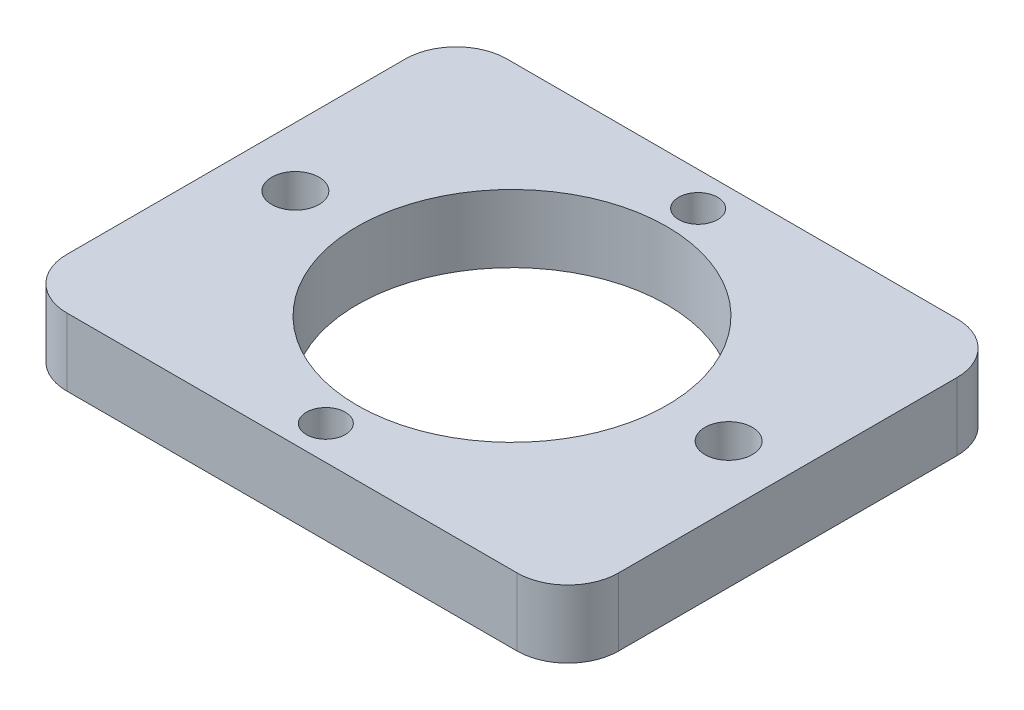
ISO-10303-21;
HEADER;
FILE_DESCRIPTION(('STEP AP214'),'2;1');
FILE_NAME('part.step','',(''),(''),'','','');
FILE_SCHEMA(('AUTOMOTIVE_DESIGN { 1 0 10303 214 1 1 1 1 }'));
ENDSEC;
DATA;
#1=APPLICATION_CONTEXT('core data for automotive mechanical design processes');
#2=APPLICATION_PROTOCOL_DEFINITION('international standard','automotive_design',2000,#1);
#3=PRODUCT_CONTEXT('',#1,'mechanical');
#4=PRODUCT('Part','Part','',(#3));
#5=PRODUCT_RELATED_PRODUCT_CATEGORY('part','',(#4));
#6=PRODUCT_DEFINITION_FORMATION('','',#4);
#7=PRODUCT_DEFINITION_CONTEXT('part definition',#1,'design');
#8=PRODUCT_DEFINITION('design','',#6,#7);
#9=PRODUCT_DEFINITION_SHAPE('','',#8);
#10=(LENGTH_UNIT() NAMED_UNIT(*) SI_UNIT(.MILLI.,.METRE.));
#11=(NAMED_UNIT(*) PLANE_ANGLE_UNIT() SI_UNIT($,.RADIAN.));
#12=(NAMED_UNIT(*) SI_UNIT($,.STERADIAN.) SOLID_ANGLE_UNIT());
#13=UNCERTAINTY_MEASURE_WITH_UNIT(LENGTH_MEASURE(1.E-05),#10,'distance_accuracy_value','');
#14=(GEOMETRIC_REPRESENTATION_CONTEXT(3) GLOBAL_UNCERTAINTY_ASSIGNED_CONTEXT((#13)) GLOBAL_UNIT_ASSIGNED_CONTEXT((#10,
#11,#12)) REPRESENTATION_CONTEXT('',''));
#15=CARTESIAN_POINT('',(0.,0.,0.));
#16=DIRECTION('',(0.,0.,1.));
#17=DIRECTION('',(1.,0.,0.));
#18=AXIS2_PLACEMENT_3D('',#15,#16,#17);
#19=CARTESIAN_POINT('',(0.,4.,0.));
#20=DIRECTION('',(1.,0.,0.));
#21=DIRECTION('',(0.,0.,-1.));
#22=AXIS2_PLACEMENT_3D('',#19,#20,#21);
#23=PLANE('',#22);
#24=DIRECTION('',(0.,0.,1.));
#25=VECTOR('',#24,1.);
#26=CARTESIAN_POINT('',(0.,0.,0.));
#27=LINE('',#26,#25);
#28=CARTESIAN_POINT('',(0.,0.,3.));
#29=VERTEX_POINT('',#28);
#30=CARTESIAN_POINT('',(0.,0.,23.));
#31=VERTEX_POINT('',#30);
#32=EDGE_CURVE('E130',#29,#31,#27,.T.);
#33=ORIENTED_EDGE('',*,*,#32,.T.);
#34=DIRECTION('',(0.,-1.,0.));
#35=VECTOR('',#34,1.);
#36=CARTESIAN_POINT('',(0.,4.,23.));
#37=LINE('',#36,#35);
#38=CARTESIAN_POINT('',(0.,4.,23.));
#39=VERTEX_POINT('',#38);
#40=EDGE_CURVE('E152',#31,#39,#37,.F.);
#41=ORIENTED_EDGE('',*,*,#40,.T.);
#42=DIRECTION('',(0.,0.,1.));
#43=VECTOR('',#42,1.);
#44=CARTESIAN_POINT('',(0.,4.,0.));
#45=LINE('',#44,#43);
#46=CARTESIAN_POINT('',(0.,4.,3.));
#47=VERTEX_POINT('',#46);
#48=EDGE_CURVE('E128',#47,#39,#45,.T.);
#49=ORIENTED_EDGE('',*,*,#48,.F.);
#50=DIRECTION('',(0.,-1.,0.));
#51=VECTOR('',#50,1.);
#52=CARTESIAN_POINT('',(0.,4.,3.));
#53=LINE('',#52,#51);
#54=EDGE_CURVE('E149',#47,#29,#53,.T.);
#55=ORIENTED_EDGE('',*,*,#54,.T.);
#56=EDGE_LOOP('',(#33,#41,#49,#55));
#57=FACE_BOUND('',#56,.T.);
#58=ADVANCED_FACE('F33',(#57),#23,.F.);
#59=CARTESIAN_POINT('',(0.,4.,26.));
#60=DIRECTION('',(0.,0.,-1.));
#61=DIRECTION('',(-1.,0.,0.));
#62=AXIS2_PLACEMENT_3D('',#59,#60,#61);
#63=PLANE('',#62);
#64=DIRECTION('',(1.,0.,0.));
#65=VECTOR('',#64,1.);
#66=CARTESIAN_POINT('',(0.,0.,26.));
#67=LINE('',#66,#65);
#68=CARTESIAN_POINT('',(3.,0.,26.));
#69=VERTEX_POINT('',#68);
#70=CARTESIAN_POINT('',(29.6,0.,26.));
#71=VERTEX_POINT('',#70);
#72=EDGE_CURVE('E126',#69,#71,#67,.T.);
#73=ORIENTED_EDGE('',*,*,#72,.T.);
#74=DIRECTION('',(0.,-1.,0.));
#75=VECTOR('',#74,1.);
#76=CARTESIAN_POINT('',(29.6,4.,26.));
#77=LINE('',#76,#75);
#78=CARTESIAN_POINT('',(29.6,4.,26.));
#79=VERTEX_POINT('',#78);
#80=EDGE_CURVE('E104',#71,#79,#77,.F.);
#81=ORIENTED_EDGE('',*,*,#80,.T.);
#82=DIRECTION('',(1.,0.,0.));
#83=VECTOR('',#82,1.);
#84=CARTESIAN_POINT('',(0.,4.,26.));
#85=LINE('',#84,#83);
#86=CARTESIAN_POINT('',(3.,4.,26.));
#87=VERTEX_POINT('',#86);
#88=EDGE_CURVE('E166',#87,#79,#85,.T.);
#89=ORIENTED_EDGE('',*,*,#88,.F.);
#90=DIRECTION('',(0.,-1.,0.));
#91=VECTOR('',#90,1.);
#92=CARTESIAN_POINT('',(3.,4.,26.));
#93=LINE('',#92,#91);
#94=EDGE_CURVE('E109',#87,#69,#93,.T.);
#95=ORIENTED_EDGE('',*,*,#94,.T.);
#96=EDGE_LOOP('',(#73,#81,#89,#95));
#97=FACE_BOUND('',#96,.T.);
#98=ADVANCED_FACE('F171',(#97),#63,.F.);
#99=CARTESIAN_POINT('',(32.6,4.,0.));
#100=DIRECTION('',(-1.,0.,0.));
#101=DIRECTION('',(0.,0.,1.));
#102=AXIS2_PLACEMENT_3D('',#99,#100,#101);
#103=PLANE('',#102);
#104=DIRECTION('',(0.,0.,-1.));
#105=VECTOR('',#104,1.);
#106=CARTESIAN_POINT('',(32.6,4.,0.));
#107=LINE('',#106,#105);
#108=CARTESIAN_POINT('',(32.6,4.,23.));
#109=VERTEX_POINT('',#108);
#110=CARTESIAN_POINT('',(32.6,4.,3.));
#111=VERTEX_POINT('',#110);
#112=EDGE_CURVE('E118',#109,#111,#107,.T.);
#113=ORIENTED_EDGE('',*,*,#112,.F.);
#114=DIRECTION('',(0.,-1.,0.));
#115=VECTOR('',#114,1.);
#116=CARTESIAN_POINT('',(32.6,4.,23.));
#117=LINE('',#116,#115);
#118=CARTESIAN_POINT('',(32.6,0.,23.));
#119=VERTEX_POINT('',#118);
#120=EDGE_CURVE('E103',#109,#119,#117,.T.);
#121=ORIENTED_EDGE('',*,*,#120,.T.);
#122=DIRECTION('',(0.,0.,-1.));
#123=VECTOR('',#122,1.);
#124=CARTESIAN_POINT('',(32.6,0.,0.));
#125=LINE('',#124,#123);
#126=CARTESIAN_POINT('',(32.6,0.,3.));
#127=VERTEX_POINT('',#126);
#128=EDGE_CURVE('E116',#119,#127,#125,.T.);
#129=ORIENTED_EDGE('',*,*,#128,.T.);
#130=DIRECTION('',(0.,-1.,0.));
#131=VECTOR('',#130,1.);
#132=CARTESIAN_POINT('',(32.6,4.,3.));
#133=LINE('',#132,#131);
#134=EDGE_CURVE('E120',#127,#111,#133,.F.);
#135=ORIENTED_EDGE('',*,*,#134,.T.);
#136=EDGE_LOOP('',(#113,#121,#129,#135));
#137=FACE_BOUND('',#136,.T.);
#138=ADVANCED_FACE('F115',(#137),#103,.F.);
#139=CARTESIAN_POINT('',(0.,4.,0.));
#140=DIRECTION('',(0.,0.,1.));
#141=DIRECTION('',(1.,0.,0.));
#142=AXIS2_PLACEMENT_3D('',#139,#140,#141);
#143=PLANE('',#142);
#144=DIRECTION('',(-1.,0.,0.));
#145=VECTOR('',#144,1.);
#146=CARTESIAN_POINT('',(0.,4.,0.));
#147=LINE('',#146,#145);
#148=CARTESIAN_POINT('',(29.6,4.,0.));
#149=VERTEX_POINT('',#148);
#150=CARTESIAN_POINT('',(3.,4.,0.));
#151=VERTEX_POINT('',#150);
#152=EDGE_CURVE('E134',#149,#151,#147,.T.);
#153=ORIENTED_EDGE('',*,*,#152,.F.);
#154=DIRECTION('',(0.,-1.,0.));
#155=VECTOR('',#154,1.);
#156=CARTESIAN_POINT('',(29.6,4.,0.));
#157=LINE('',#156,#155);
#158=CARTESIAN_POINT('',(29.6,0.,0.));
#159=VERTEX_POINT('',#158);
#160=EDGE_CURVE('E11',#149,#159,#157,.T.);
#161=ORIENTED_EDGE('',*,*,#160,.T.);
#162=DIRECTION('',(-1.,0.,0.));
#163=VECTOR('',#162,1.);
#164=CARTESIAN_POINT('',(0.,0.,0.));
#165=LINE('',#164,#163);
#166=CARTESIAN_POINT('',(3.,0.,0.));
#167=VERTEX_POINT('',#166);
#168=EDGE_CURVE('E125',#159,#167,#165,.T.);
#169=ORIENTED_EDGE('',*,*,#168,.T.);
#170=DIRECTION('',(0.,-1.,0.));
#171=VECTOR('',#170,1.);
#172=CARTESIAN_POINT('',(3.,4.,0.));
#173=LINE('',#172,#171);
#174=EDGE_CURVE('E41',#167,#151,#173,.F.);
#175=ORIENTED_EDGE('',*,*,#174,.T.);
#176=EDGE_LOOP('',(#153,#161,#169,#175));
#177=FACE_BOUND('',#176,.T.);
#178=ADVANCED_FACE('F219',(#177),#143,.F.);
#179=CARTESIAN_POINT('',(0.,4.,0.));
#180=DIRECTION('',(0.,1.,0.));
#181=DIRECTION('',(0.,0.,1.));
#182=AXIS2_PLACEMENT_3D('',#179,#180,#181);
#183=PLANE('',#182);
#184=CARTESIAN_POINT('',(16.3,4.,24.));
#185=DIRECTION('',(0.,1.,0.));
#186=DIRECTION('',(0.,0.,1.));
#187=AXIS2_PLACEMENT_3D('',#184,#185,#186);
#188=CIRCLE('',#187,1.15);
#189=CARTESIAN_POINT('',(16.3,4.,25.15));
#190=VERTEX_POINT('',#189);
#191=EDGE_CURVE('E195',#190,#190,#188,.T.);
#192=ORIENTED_EDGE('',*,*,#191,.F.);
#193=EDGE_LOOP('',(#192));
#194=FACE_BOUND('',#193,.T.);
#195=CARTESIAN_POINT('',(16.3,4.,2.));
#196=DIRECTION('',(0.,1.,0.));
#197=DIRECTION('',(0.,0.,1.));
#198=AXIS2_PLACEMENT_3D('',#195,#196,#197);
#199=CIRCLE('',#198,1.15);
#200=CARTESIAN_POINT('',(16.3,4.,3.15));
#201=VERTEX_POINT('',#200);
#202=EDGE_CURVE('E201',#201,#201,#199,.T.);
#203=ORIENTED_EDGE('',*,*,#202,.F.);
#204=EDGE_LOOP('',(#203));
#205=FACE_BOUND('',#204,.T.);
#206=CARTESIAN_POINT('',(29.1,4.,13.));
#207=DIRECTION('',(0.,1.,0.));
#208=DIRECTION('',(0.,0.,1.));
#209=AXIS2_PLACEMENT_3D('',#206,#207,#208);
#210=CIRCLE('',#209,1.4);
#211=CARTESIAN_POINT('',(29.1,4.,14.4));
#212=VERTEX_POINT('',#211);
#213=EDGE_CURVE('E183',#212,#212,#210,.T.);
#214=ORIENTED_EDGE('',*,*,#213,.F.);
#215=EDGE_LOOP('',(#214));
#216=FACE_BOUND('',#215,.T.);
#217=CARTESIAN_POINT('',(3.5,4.,13.));
#218=DIRECTION('',(0.,1.,0.));
#219=DIRECTION('',(0.,0.,1.));
#220=AXIS2_PLACEMENT_3D('',#217,#218,#219);
#221=CIRCLE('',#220,1.4);
#222=CARTESIAN_POINT('',(3.5,4.,14.4));
#223=VERTEX_POINT('',#222);
#224=EDGE_CURVE('E190',#223,#223,#221,.T.);
#225=ORIENTED_EDGE('',*,*,#224,.F.);
#226=EDGE_LOOP('',(#225));
#227=FACE_BOUND('',#226,.T.);
#228=CARTESIAN_POINT('',(16.3,4.,13.));
#229=DIRECTION('',(0.,1.,0.));
#230=DIRECTION('',(0.,0.,1.));
#231=AXIS2_PLACEMENT_3D('',#228,#229,#230);
#232=CIRCLE('',#231,9.15);
#233=CARTESIAN_POINT('',(16.3,4.,22.15));
#234=VERTEX_POINT('',#233);
#235=EDGE_CURVE('E174',#234,#234,#232,.T.);
#236=ORIENTED_EDGE('',*,*,#235,.F.);
#237=EDGE_LOOP('',(#236));
#238=FACE_BOUND('',#237,.T.);
#239=ORIENTED_EDGE('',*,*,#88,.T.);
#240=CARTESIAN_POINT('',(29.6,4.,23.));
#241=DIRECTION('',(0.,1.,0.));
#242=DIRECTION('',(0.,0.,1.));
#243=AXIS2_PLACEMENT_3D('',#240,#241,#242);
#244=CIRCLE('',#243,3.);
#245=EDGE_CURVE('E147',#79,#109,#244,.T.);
#246=ORIENTED_EDGE('',*,*,#245,.T.);
#247=ORIENTED_EDGE('',*,*,#112,.T.);
#248=CARTESIAN_POINT('',(29.6,4.,3.));
#249=DIRECTION('',(0.,1.,0.));
#250=DIRECTION('',(0.,0.,1.));
#251=AXIS2_PLACEMENT_3D('',#248,#249,#250);
#252=CIRCLE('',#251,3.);
#253=EDGE_CURVE('E54',#111,#149,#252,.T.);
#254=ORIENTED_EDGE('',*,*,#253,.T.);
#255=ORIENTED_EDGE('',*,*,#152,.T.);
#256=CARTESIAN_POINT('',(3.,4.,3.));
#257=DIRECTION('',(0.,1.,0.));
#258=DIRECTION('',(0.,0.,1.));
#259=AXIS2_PLACEMENT_3D('',#256,#257,#258);
#260=CIRCLE('',#259,3.);
#261=EDGE_CURVE('E142',#151,#47,#260,.T.);
#262=ORIENTED_EDGE('',*,*,#261,.T.);
#263=ORIENTED_EDGE('',*,*,#48,.T.);
#264=CARTESIAN_POINT('',(3.,4.,23.));
#265=DIRECTION('',(0.,1.,0.));
#266=DIRECTION('',(0.,0.,1.));
#267=AXIS2_PLACEMENT_3D('',#264,#265,#266);
#268=CIRCLE('',#267,3.);
#269=EDGE_CURVE('E145',#39,#87,#268,.T.);
#270=ORIENTED_EDGE('',*,*,#269,.T.);
#271=EDGE_LOOP('',(#239,#246,#247,#254,#255,#262,#263,#270));
#272=FACE_BOUND('',#271,.T.);
#273=ADVANCED_FACE('F163',(#194,#205,#216,#227,#238,#272),#183,.T.);
#274=CARTESIAN_POINT('',(0.,0.,0.));
#275=DIRECTION('',(0.,1.,0.));
#276=DIRECTION('',(0.,0.,1.));
#277=AXIS2_PLACEMENT_3D('',#274,#275,#276);
#278=PLANE('',#277);
#279=CARTESIAN_POINT('',(16.3,0.,24.));
#280=DIRECTION('',(0.,1.,0.));
#281=DIRECTION('',(0.,0.,1.));
#282=AXIS2_PLACEMENT_3D('',#279,#280,#281);
#283=CIRCLE('',#282,1.15);
#284=CARTESIAN_POINT('',(16.3,0.,25.15));
#285=VERTEX_POINT('',#284);
#286=EDGE_CURVE('E198',#285,#285,#283,.T.);
#287=ORIENTED_EDGE('',*,*,#286,.T.);
#288=EDGE_LOOP('',(#287));
#289=FACE_BOUND('',#288,.T.);
#290=CARTESIAN_POINT('',(16.3,0.,2.));
#291=DIRECTION('',(0.,1.,0.));
#292=DIRECTION('',(0.,0.,1.));
#293=AXIS2_PLACEMENT_3D('',#290,#291,#292);
#294=CIRCLE('',#293,1.15);
#295=CARTESIAN_POINT('',(16.3,0.,3.15));
#296=VERTEX_POINT('',#295);
#297=EDGE_CURVE('E187',#296,#296,#294,.T.);
#298=ORIENTED_EDGE('',*,*,#297,.T.);
#299=EDGE_LOOP('',(#298));
#300=FACE_BOUND('',#299,.T.);
#301=CARTESIAN_POINT('',(29.1,0.,13.));
#302=DIRECTION('',(0.,1.,0.));
#303=DIRECTION('',(0.,0.,1.));
#304=AXIS2_PLACEMENT_3D('',#301,#302,#303);
#305=CIRCLE('',#304,1.4);
#306=CARTESIAN_POINT('',(29.1,0.,14.4));
#307=VERTEX_POINT('',#306);
#308=EDGE_CURVE('E186',#307,#307,#305,.T.);
#309=ORIENTED_EDGE('',*,*,#308,.T.);
#310=EDGE_LOOP('',(#309));
#311=FACE_BOUND('',#310,.T.);
#312=CARTESIAN_POINT('',(3.5,0.,13.));
#313=DIRECTION('',(0.,1.,0.));
#314=DIRECTION('',(0.,0.,1.));
#315=AXIS2_PLACEMENT_3D('',#312,#313,#314);
#316=CIRCLE('',#315,1.4);
#317=CARTESIAN_POINT('',(3.5,0.,14.4));
#318=VERTEX_POINT('',#317);
#319=EDGE_CURVE('E181',#318,#318,#316,.T.);
#320=ORIENTED_EDGE('',*,*,#319,.T.);
#321=EDGE_LOOP('',(#320));
#322=FACE_BOUND('',#321,.T.);
#323=CARTESIAN_POINT('',(16.3,0.,13.));
#324=DIRECTION('',(0.,1.,0.));
#325=DIRECTION('',(0.,0.,1.));
#326=AXIS2_PLACEMENT_3D('',#323,#324,#325);
#327=CIRCLE('',#326,9.15);
#328=CARTESIAN_POINT('',(16.3,0.,22.15));
#329=VERTEX_POINT('',#328);
#330=EDGE_CURVE('E172',#329,#329,#327,.T.);
#331=ORIENTED_EDGE('',*,*,#330,.T.);
#332=EDGE_LOOP('',(#331));
#333=FACE_BOUND('',#332,.T.);
#334=ORIENTED_EDGE('',*,*,#128,.F.);
#335=CARTESIAN_POINT('',(29.6,0.,23.));
#336=DIRECTION('',(0.,1.,0.));
#337=DIRECTION('',(0.,0.,1.));
#338=AXIS2_PLACEMENT_3D('',#335,#336,#337);
#339=CIRCLE('',#338,3.);
#340=EDGE_CURVE('E99',#119,#71,#339,.F.);
#341=ORIENTED_EDGE('',*,*,#340,.T.);
#342=ORIENTED_EDGE('',*,*,#72,.F.);
#343=CARTESIAN_POINT('',(3.,0.,23.));
#344=DIRECTION('',(0.,1.,0.));
#345=DIRECTION('',(0.,0.,1.));
#346=AXIS2_PLACEMENT_3D('',#343,#344,#345);
#347=CIRCLE('',#346,3.);
#348=EDGE_CURVE('E110',#69,#31,#347,.F.);
#349=ORIENTED_EDGE('',*,*,#348,.T.);
#350=ORIENTED_EDGE('',*,*,#32,.F.);
#351=CARTESIAN_POINT('',(3.,0.,3.));
#352=DIRECTION('',(0.,1.,0.));
#353=DIRECTION('',(0.,0.,1.));
#354=AXIS2_PLACEMENT_3D('',#351,#352,#353);
#355=CIRCLE('',#354,3.);
#356=EDGE_CURVE('E119',#29,#167,#355,.F.);
#357=ORIENTED_EDGE('',*,*,#356,.T.);
#358=ORIENTED_EDGE('',*,*,#168,.F.);
#359=CARTESIAN_POINT('',(29.6,0.,3.));
#360=DIRECTION('',(0.,1.,0.));
#361=DIRECTION('',(0.,0.,1.));
#362=AXIS2_PLACEMENT_3D('',#359,#360,#361);
#363=CIRCLE('',#362,3.);
#364=EDGE_CURVE('E124',#159,#127,#363,.F.);
#365=ORIENTED_EDGE('',*,*,#364,.T.);
#366=EDGE_LOOP('',(#334,#341,#342,#349,#350,#357,#358,#365));
#367=FACE_BOUND('',#366,.T.);
#368=ADVANCED_FACE('F122',(#289,#300,#311,#322,#333,#367),#278,.F.);
#369=CARTESIAN_POINT('',(16.3,0.,13.));
#370=DIRECTION('',(0.,1.,0.));
#371=DIRECTION('',(0.,0.,1.));
#372=AXIS2_PLACEMENT_3D('',#369,#370,#371);
#373=CYLINDRICAL_SURFACE('',#372,9.15);
#374=ORIENTED_EDGE('',*,*,#330,.F.);
#375=EDGE_LOOP('',(#374));
#376=FACE_BOUND('',#375,.T.);
#377=ORIENTED_EDGE('',*,*,#235,.T.);
#378=EDGE_LOOP('',(#377));
#379=FACE_BOUND('',#378,.T.);
#380=ADVANCED_FACE('F228',(#376,#379),#373,.F.);
#381=CARTESIAN_POINT('',(3.5,0.,13.));
#382=DIRECTION('',(0.,1.,0.));
#383=DIRECTION('',(0.,0.,1.));
#384=AXIS2_PLACEMENT_3D('',#381,#382,#383);
#385=CYLINDRICAL_SURFACE('',#384,1.4);
#386=ORIENTED_EDGE('',*,*,#319,.F.);
#387=EDGE_LOOP('',(#386));
#388=FACE_BOUND('',#387,.T.);
#389=ORIENTED_EDGE('',*,*,#224,.T.);
#390=EDGE_LOOP('',(#389));
#391=FACE_BOUND('',#390,.T.);
#392=ADVANCED_FACE('F230',(#388,#391),#385,.F.);
#393=CARTESIAN_POINT('',(29.1,0.,13.));
#394=DIRECTION('',(0.,1.,0.));
#395=DIRECTION('',(0.,0.,1.));
#396=AXIS2_PLACEMENT_3D('',#393,#394,#395);
#397=CYLINDRICAL_SURFACE('',#396,1.4);
#398=ORIENTED_EDGE('',*,*,#308,.F.);
#399=EDGE_LOOP('',(#398));
#400=FACE_BOUND('',#399,.T.);
#401=ORIENTED_EDGE('',*,*,#213,.T.);
#402=EDGE_LOOP('',(#401));
#403=FACE_BOUND('',#402,.T.);
#404=ADVANCED_FACE('F213',(#400,#403),#397,.F.);
#405=CARTESIAN_POINT('',(16.3,0.,2.));
#406=DIRECTION('',(0.,1.,0.));
#407=DIRECTION('',(0.,0.,1.));
#408=AXIS2_PLACEMENT_3D('',#405,#406,#407);
#409=CYLINDRICAL_SURFACE('',#408,1.15);
#410=ORIENTED_EDGE('',*,*,#297,.F.);
#411=EDGE_LOOP('',(#410));
#412=FACE_BOUND('',#411,.T.);
#413=ORIENTED_EDGE('',*,*,#202,.T.);
#414=EDGE_LOOP('',(#413));
#415=FACE_BOUND('',#414,.T.);
#416=ADVANCED_FACE('F209',(#412,#415),#409,.F.);
#417=CARTESIAN_POINT('',(16.3,0.,24.));
#418=DIRECTION('',(0.,1.,0.));
#419=DIRECTION('',(0.,0.,1.));
#420=AXIS2_PLACEMENT_3D('',#417,#418,#419);
#421=CYLINDRICAL_SURFACE('',#420,1.15);
#422=ORIENTED_EDGE('',*,*,#286,.F.);
#423=EDGE_LOOP('',(#422));
#424=FACE_BOUND('',#423,.T.);
#425=ORIENTED_EDGE('',*,*,#191,.T.);
#426=EDGE_LOOP('',(#425));
#427=FACE_BOUND('',#426,.T.);
#428=ADVANCED_FACE('F212',(#424,#427),#421,.F.);
#429=CARTESIAN_POINT('',(29.6,4.,23.));
#430=DIRECTION('',(0.,-1.,0.));
#431=DIRECTION('',(0.,0.,-1.));
#432=AXIS2_PLACEMENT_3D('',#429,#430,#431);
#433=CYLINDRICAL_SURFACE('',#432,3.);
#434=ORIENTED_EDGE('',*,*,#245,.F.);
#435=ORIENTED_EDGE('',*,*,#80,.F.);
#436=ORIENTED_EDGE('',*,*,#340,.F.);
#437=ORIENTED_EDGE('',*,*,#120,.F.);
#438=EDGE_LOOP('',(#434,#435,#436,#437));
#439=FACE_BOUND('',#438,.T.);
#440=ADVANCED_FACE('F102',(#439),#433,.T.);
#441=CARTESIAN_POINT('',(3.,4.,23.));
#442=DIRECTION('',(0.,-1.,0.));
#443=DIRECTION('',(0.,0.,-1.));
#444=AXIS2_PLACEMENT_3D('',#441,#442,#443);
#445=CYLINDRICAL_SURFACE('',#444,3.);
#446=ORIENTED_EDGE('',*,*,#269,.F.);
#447=ORIENTED_EDGE('',*,*,#40,.F.);
#448=ORIENTED_EDGE('',*,*,#348,.F.);
#449=ORIENTED_EDGE('',*,*,#94,.F.);
#450=EDGE_LOOP('',(#446,#447,#448,#449));
#451=FACE_BOUND('',#450,.T.);
#452=ADVANCED_FACE('F169',(#451),#445,.T.);
#453=CARTESIAN_POINT('',(29.6,4.,3.));
#454=DIRECTION('',(0.,-1.,0.));
#455=DIRECTION('',(0.,0.,-1.));
#456=AXIS2_PLACEMENT_3D('',#453,#454,#455);
#457=CYLINDRICAL_SURFACE('',#456,3.);
#458=ORIENTED_EDGE('',*,*,#253,.F.);
#459=ORIENTED_EDGE('',*,*,#134,.F.);
#460=ORIENTED_EDGE('',*,*,#364,.F.);
#461=ORIENTED_EDGE('',*,*,#160,.F.);
#462=EDGE_LOOP('',(#458,#459,#460,#461));
#463=FACE_BOUND('',#462,.T.);
#464=ADVANCED_FACE('F254',(#463),#457,.T.);
#465=CARTESIAN_POINT('',(3.,4.,3.));
#466=DIRECTION('',(0.,-1.,0.));
#467=DIRECTION('',(0.,0.,-1.));
#468=AXIS2_PLACEMENT_3D('',#465,#466,#467);
#469=CYLINDRICAL_SURFACE('',#468,3.);
#470=ORIENTED_EDGE('',*,*,#261,.F.);
#471=ORIENTED_EDGE('',*,*,#174,.F.);
#472=ORIENTED_EDGE('',*,*,#356,.F.);
#473=ORIENTED_EDGE('',*,*,#54,.F.);
#474=EDGE_LOOP('',(#470,#471,#472,#473));
#475=FACE_BOUND('',#474,.T.);
#476=ADVANCED_FACE('F35',(#475),#469,.T.);
#477=CLOSED_SHELL('',(#58,#98,#138,#178,#273,#368,#380,#392,#404,#416,#428,#440,#452,#464,#476));
#478=MANIFOLD_SOLID_BREP('B2',#477);
#479=ADVANCED_BREP_SHAPE_REPRESENTATION('',(#18,#478),#14);
#480=SHAPE_DEFINITION_REPRESENTATION(#9,#479);
ENDSEC;
END-ISO-10303-21;
